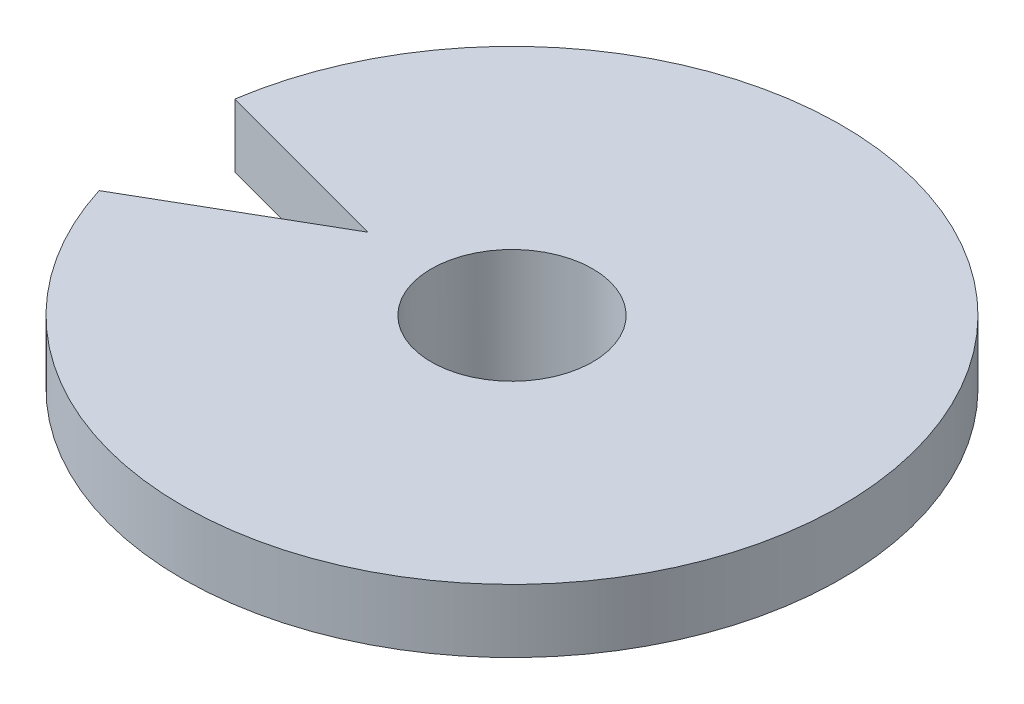
ISO-10303-21;
HEADER;
FILE_DESCRIPTION(('STEP AP214'),'2;1');
FILE_NAME('part.step','',(''),(''),'','','');
FILE_SCHEMA(('AUTOMOTIVE_DESIGN { 1 0 10303 214 1 1 1 1 }'));
ENDSEC;
DATA;
#1=APPLICATION_CONTEXT('core data for automotive mechanical design processes');
#2=APPLICATION_PROTOCOL_DEFINITION('international standard','automotive_design',2000,#1);
#3=PRODUCT_CONTEXT('',#1,'mechanical');
#4=PRODUCT('Part','Part','',(#3));
#5=PRODUCT_RELATED_PRODUCT_CATEGORY('part','',(#4));
#6=PRODUCT_DEFINITION_FORMATION('','',#4);
#7=PRODUCT_DEFINITION_CONTEXT('part definition',#1,'design');
#8=PRODUCT_DEFINITION('design','',#6,#7);
#9=PRODUCT_DEFINITION_SHAPE('','',#8);
#10=(LENGTH_UNIT() NAMED_UNIT(*) SI_UNIT(.MILLI.,.METRE.));
#11=(NAMED_UNIT(*) PLANE_ANGLE_UNIT() SI_UNIT($,.RADIAN.));
#12=(NAMED_UNIT(*) SI_UNIT($,.STERADIAN.) SOLID_ANGLE_UNIT());
#13=UNCERTAINTY_MEASURE_WITH_UNIT(LENGTH_MEASURE(1.E-05),#10,'distance_accuracy_value','');
#14=(GEOMETRIC_REPRESENTATION_CONTEXT(3) GLOBAL_UNCERTAINTY_ASSIGNED_CONTEXT((#13)) GLOBAL_UNIT_ASSIGNED_CONTEXT((#10,
#11,#12)) REPRESENTATION_CONTEXT('',''));
#15=CARTESIAN_POINT('',(0.,0.,0.));
#16=DIRECTION('',(0.,0.,1.));
#17=DIRECTION('',(1.,0.,0.));
#18=AXIS2_PLACEMENT_3D('',#15,#16,#17);
#19=CARTESIAN_POINT('',(0.,0.,0.));
#20=DIRECTION('',(0.,1.,0.));
#21=DIRECTION('',(0.,0.,1.));
#22=AXIS2_PLACEMENT_3D('',#19,#20,#21);
#23=PLANE('',#22);
#24=CARTESIAN_POINT('',(0.,0.,0.));
#25=DIRECTION('',(0.,1.,0.));
#26=DIRECTION('',(0.,0.,1.));
#27=AXIS2_PLACEMENT_3D('',#24,#25,#26);
#28=CIRCLE('',#27,5.685);
#29=CARTESIAN_POINT('',(0.,0.,5.685));
#30=VERTEX_POINT('',#29);
#31=EDGE_CURVE('E87',#30,#30,#28,.T.);
#32=ORIENTED_EDGE('',*,*,#31,.F.);
#33=EDGE_LOOP('',(#32));
#34=FACE_BOUND('',#33,.T.);
#35=CARTESIAN_POINT('',(0.,0.,0.));
#36=DIRECTION('',(0.,1.,0.));
#37=DIRECTION('',(0.,0.,1.));
#38=AXIS2_PLACEMENT_3D('',#35,#36,#37);
#39=CIRCLE('',#38,3.185);
#40=CARTESIAN_POINT('',(0.,0.,3.185));
#41=VERTEX_POINT('',#40);
#42=EDGE_CURVE('E73',#41,#41,#39,.T.);
#43=ORIENTED_EDGE('',*,*,#42,.T.);
#44=EDGE_LOOP('',(#43));
#45=FACE_BOUND('',#44,.T.);
#46=ADVANCED_FACE('F33',(#34,#45),#23,.F.);
#47=CARTESIAN_POINT('',(0.,4.46,0.));
#48=DIRECTION('',(0.,-1.,0.));
#49=DIRECTION('',(0.,0.,-1.));
#50=AXIS2_PLACEMENT_3D('',#47,#48,#49);
#51=CYLINDRICAL_SURFACE('',#50,5.685);
#52=CARTESIAN_POINT('',(0.,4.46,0.));
#53=DIRECTION('',(0.,1.,0.));
#54=DIRECTION('',(0.,0.,1.));
#55=AXIS2_PLACEMENT_3D('',#52,#53,#54);
#56=CIRCLE('',#55,5.685);
#57=CARTESIAN_POINT('',(-5.685,4.46,0.));
#58=VERTEX_POINT('',#57);
#59=EDGE_CURVE('E86',#58,#58,#56,.T.);
#60=ORIENTED_EDGE('',*,*,#59,.F.);
#61=EDGE_LOOP('',(#60));
#62=FACE_BOUND('',#61,.T.);
#63=ORIENTED_EDGE('',*,*,#31,.T.);
#64=EDGE_LOOP('',(#63));
#65=FACE_BOUND('',#64,.T.);
#66=ADVANCED_FACE('F35',(#62,#65),#51,.T.);
#67=CARTESIAN_POINT('',(0.,4.46,0.));
#68=DIRECTION('',(0.,-1.,0.));
#69=DIRECTION('',(0.,0.,-1.));
#70=AXIS2_PLACEMENT_3D('',#67,#68,#69);
#71=CYLINDRICAL_SURFACE('',#70,3.185);
#72=ORIENTED_EDGE('',*,*,#42,.F.);
#73=EDGE_LOOP('',(#72));
#74=FACE_BOUND('',#73,.T.);
#75=CARTESIAN_POINT('',(0.,6.96,0.));
#76=DIRECTION('',(0.,-1.,0.));
#77=DIRECTION('',(0.,0.,-1.));
#78=AXIS2_PLACEMENT_3D('',#75,#76,#77);
#79=CIRCLE('',#78,3.185);
#80=CARTESIAN_POINT('',(0.,6.96,-3.185));
#81=VERTEX_POINT('',#80);
#82=EDGE_CURVE('E94',#81,#81,#79,.T.);
#83=ORIENTED_EDGE('',*,*,#82,.F.);
#84=EDGE_LOOP('',(#83));
#85=FACE_BOUND('',#84,.T.);
#86=ADVANCED_FACE('F117',(#74,#85),#71,.F.);
#87=CARTESIAN_POINT('',(0.,4.46,0.));
#88=DIRECTION('',(0.,1.,0.));
#89=DIRECTION('',(0.,0.,1.));
#90=AXIS2_PLACEMENT_3D('',#87,#88,#89);
#91=PLANE('',#90);
#92=CARTESIAN_POINT('',(0.,4.46,0.));
#93=DIRECTION('',(0.,1.,0.));
#94=DIRECTION('',(0.,0.,1.));
#95=AXIS2_PLACEMENT_3D('',#92,#93,#94);
#96=CIRCLE('',#95,13.);
#97=CARTESIAN_POINT('',(-12.4071566677494,4.46,3.88103896165994));
#98=VERTEX_POINT('',#97);
#99=CARTESIAN_POINT('',(-12.8571682104693,4.46,-1.92177667997543));
#100=VERTEX_POINT('',#99);
#101=EDGE_CURVE('E74',#98,#100,#96,.T.);
#102=ORIENTED_EDGE('',*,*,#101,.F.);
#103=DIRECTION('',(0.866025403784438,0.,-0.500000000000001));
#104=VECTOR('',#103,1.);
#105=CARTESIAN_POINT('',(-1.42125,4.46,-2.46167721025727));
#106=LINE('',#105,#104);
#107=EDGE_CURVE('E48',#98,#58,#106,.T.);
#108=ORIENTED_EDGE('',*,*,#107,.T.);
#109=ORIENTED_EDGE('',*,*,#59,.T.);
#110=DIRECTION('',(-0.965925826289068,0.,-0.258819045102522));
#111=VECTOR('',#110,1.);
#112=CARTESIAN_POINT('',(-0.380822789742736,4.46,1.42125000000001));
#113=LINE('',#112,#111);
#114=EDGE_CURVE('E99',#58,#100,#113,.T.);
#115=ORIENTED_EDGE('',*,*,#114,.T.);
#116=EDGE_LOOP('',(#102,#108,#109,#115));
#117=FACE_BOUND('',#116,.T.);
#118=ADVANCED_FACE('F124',(#117),#91,.F.);
#119=CARTESIAN_POINT('',(0.,6.96,0.));
#120=DIRECTION('',(0.,-1.,0.));
#121=DIRECTION('',(0.,0.,-1.));
#122=AXIS2_PLACEMENT_3D('',#119,#120,#121);
#123=CYLINDRICAL_SURFACE('',#122,13.);
#124=CARTESIAN_POINT('',(0.,6.96,0.));
#125=DIRECTION('',(0.,1.,0.));
#126=DIRECTION('',(0.,0.,1.));
#127=AXIS2_PLACEMENT_3D('',#124,#125,#126);
#128=CIRCLE('',#127,13.);
#129=CARTESIAN_POINT('',(-12.4071566677494,6.96,3.88103896165994));
#130=VERTEX_POINT('',#129);
#131=CARTESIAN_POINT('',(-12.8571682104693,6.96,-1.92177667997543));
#132=VERTEX_POINT('',#131);
#133=EDGE_CURVE('E68',#130,#132,#128,.T.);
#134=ORIENTED_EDGE('',*,*,#133,.F.);
#135=DIRECTION('',(0.,1.,0.));
#136=VECTOR('',#135,1.);
#137=CARTESIAN_POINT('',(-12.4071566677494,-47.8930931633601,3.88103896165994));
#138=LINE('',#137,#136);
#139=EDGE_CURVE('E55',#98,#130,#138,.T.);
#140=ORIENTED_EDGE('',*,*,#139,.F.);
#141=ORIENTED_EDGE('',*,*,#101,.T.);
#142=DIRECTION('',(0.,1.,0.));
#143=VECTOR('',#142,1.);
#144=CARTESIAN_POINT('',(-12.8571682104693,-47.8930931633601,-1.92177667997543));
#145=LINE('',#144,#143);
#146=EDGE_CURVE('E77',#100,#132,#145,.T.);
#147=ORIENTED_EDGE('',*,*,#146,.T.);
#148=EDGE_LOOP('',(#134,#140,#141,#147));
#149=FACE_BOUND('',#148,.T.);
#150=ADVANCED_FACE('F78',(#149),#123,.T.);
#151=CARTESIAN_POINT('',(0.,6.96,0.));
#152=DIRECTION('',(0.,1.,0.));
#153=DIRECTION('',(0.,0.,1.));
#154=AXIS2_PLACEMENT_3D('',#151,#152,#153);
#155=PLANE('',#154);
#156=DIRECTION('',(0.866025403784438,0.,-0.500000000000001));
#157=VECTOR('',#156,1.);
#158=CARTESIAN_POINT('',(-1.42125,6.96,-2.46167721025727));
#159=LINE('',#158,#157);
#160=CARTESIAN_POINT('',(-5.685,6.96,0.));
#161=VERTEX_POINT('',#160);
#162=EDGE_CURVE('E11',#130,#161,#159,.T.);
#163=ORIENTED_EDGE('',*,*,#162,.F.);
#164=ORIENTED_EDGE('',*,*,#133,.T.);
#165=DIRECTION('',(-0.965925826289068,0.,-0.258819045102522));
#166=VECTOR('',#165,1.);
#167=CARTESIAN_POINT('',(-0.380822789742736,6.96,1.42125000000001));
#168=LINE('',#167,#166);
#169=EDGE_CURVE('E41',#161,#132,#168,.T.);
#170=ORIENTED_EDGE('',*,*,#169,.F.);
#171=EDGE_LOOP('',(#163,#164,#170));
#172=FACE_BOUND('',#171,.T.);
#173=ORIENTED_EDGE('',*,*,#82,.T.);
#174=EDGE_LOOP('',(#173));
#175=FACE_BOUND('',#174,.T.);
#176=ADVANCED_FACE('F70',(#172,#175),#155,.T.);
#177=CARTESIAN_POINT('',(-5.685,-47.8930931633601,0.));
#178=DIRECTION('',(0.500000000000001,0.,0.866025403784438));
#179=DIRECTION('',(0.866025403784438,0.,-0.500000000000001));
#180=AXIS2_PLACEMENT_3D('',#177,#178,#179);
#181=PLANE('',#180);
#182=ORIENTED_EDGE('',*,*,#107,.F.);
#183=ORIENTED_EDGE('',*,*,#139,.T.);
#184=ORIENTED_EDGE('',*,*,#162,.T.);
#185=DIRECTION('',(0.,1.,0.));
#186=VECTOR('',#185,1.);
#187=CARTESIAN_POINT('',(-5.685,-47.8930931633601,0.));
#188=LINE('',#187,#186);
#189=EDGE_CURVE('E81',#58,#161,#188,.T.);
#190=ORIENTED_EDGE('',*,*,#189,.F.);
#191=EDGE_LOOP('',(#182,#183,#184,#190));
#192=FACE_BOUND('',#191,.T.);
#193=ADVANCED_FACE('F103',(#192),#181,.F.);
#194=CARTESIAN_POINT('',(-5.685,-47.8930931633601,0.));
#195=DIRECTION('',(0.258819045102522,0.,-0.965925826289068));
#196=DIRECTION('',(-0.965925826289068,0.,-0.258819045102522));
#197=AXIS2_PLACEMENT_3D('',#194,#195,#196);
#198=PLANE('',#197);
#199=ORIENTED_EDGE('',*,*,#114,.F.);
#200=ORIENTED_EDGE('',*,*,#189,.T.);
#201=ORIENTED_EDGE('',*,*,#169,.T.);
#202=ORIENTED_EDGE('',*,*,#146,.F.);
#203=EDGE_LOOP('',(#199,#200,#201,#202));
#204=FACE_BOUND('',#203,.T.);
#205=ADVANCED_FACE('F84',(#204),#198,.F.);
#206=CLOSED_SHELL('',(#46,#66,#86,#118,#150,#176,#193,#205));
#207=MANIFOLD_SOLID_BREP('B2',#206);
#208=ADVANCED_BREP_SHAPE_REPRESENTATION('',(#18,#207),#14);
#209=SHAPE_DEFINITION_REPRESENTATION(#9,#208);
ENDSEC;
END-ISO-10303-21;
